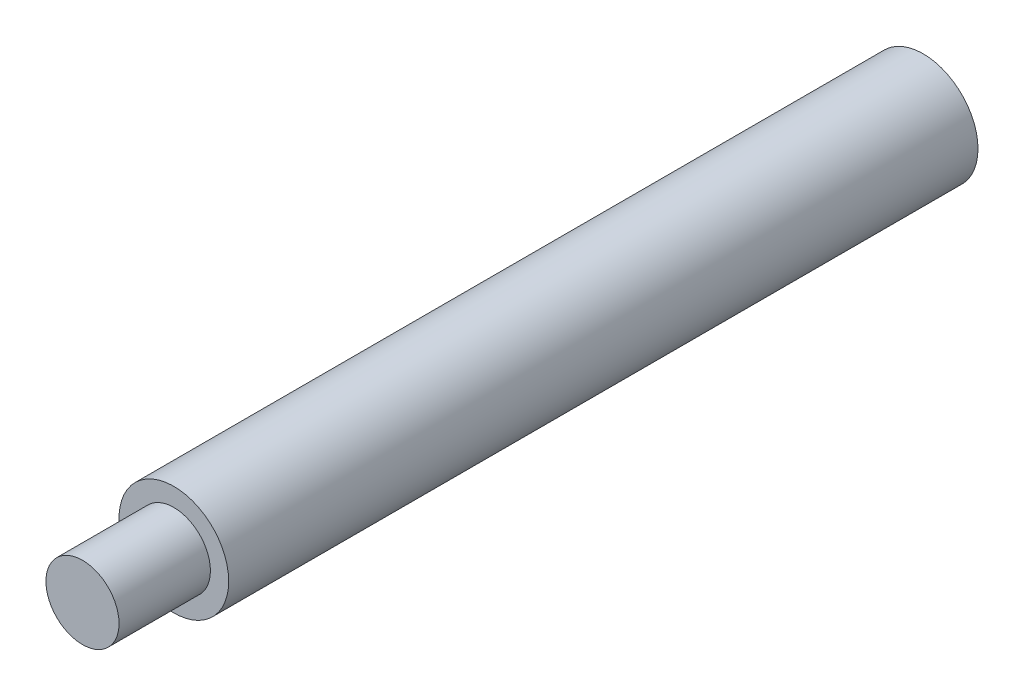
ISO-10303-21;
HEADER;
FILE_DESCRIPTION(('STEP AP214'),'2;1');
FILE_NAME('part.step','',(''),(''),'','','');
FILE_SCHEMA(('AUTOMOTIVE_DESIGN { 1 0 10303 214 1 1 1 1 }'));
ENDSEC;
DATA;
#1=APPLICATION_CONTEXT('core data for automotive mechanical design processes');
#2=APPLICATION_PROTOCOL_DEFINITION('international standard','automotive_design',2000,#1);
#3=PRODUCT_CONTEXT('',#1,'mechanical');
#4=PRODUCT('Part','Part','',(#3));
#5=PRODUCT_RELATED_PRODUCT_CATEGORY('part','',(#4));
#6=PRODUCT_DEFINITION_FORMATION('','',#4);
#7=PRODUCT_DEFINITION_CONTEXT('part definition',#1,'design');
#8=PRODUCT_DEFINITION('design','',#6,#7);
#9=PRODUCT_DEFINITION_SHAPE('','',#8);
#10=(LENGTH_UNIT() NAMED_UNIT(*) SI_UNIT(.MILLI.,.METRE.));
#11=(NAMED_UNIT(*) PLANE_ANGLE_UNIT() SI_UNIT($,.RADIAN.));
#12=(NAMED_UNIT(*) SI_UNIT($,.STERADIAN.) SOLID_ANGLE_UNIT());
#13=UNCERTAINTY_MEASURE_WITH_UNIT(LENGTH_MEASURE(1.E-05),#10,'distance_accuracy_value','');
#14=(GEOMETRIC_REPRESENTATION_CONTEXT(3) GLOBAL_UNCERTAINTY_ASSIGNED_CONTEXT((#13)) GLOBAL_UNIT_ASSIGNED_CONTEXT((#10,
#11,#12)) REPRESENTATION_CONTEXT('',''));
#15=CARTESIAN_POINT('',(0.,0.,0.));
#16=DIRECTION('',(0.,0.,1.));
#17=DIRECTION('',(1.,0.,0.));
#18=AXIS2_PLACEMENT_3D('',#15,#16,#17);
#19=CARTESIAN_POINT('',(0.,0.,2.5));
#20=DIRECTION('',(0.,0.,-1.));
#21=DIRECTION('',(-1.,0.,0.));
#22=AXIS2_PLACEMENT_3D('',#19,#20,#21);
#23=CYLINDRICAL_SURFACE('',#22,1.);
#24=CARTESIAN_POINT('',(0.,0.,2.5));
#25=DIRECTION('',(0.,0.,1.));
#26=DIRECTION('',(1.,0.,0.));
#27=AXIS2_PLACEMENT_3D('',#24,#25,#26);
#28=CIRCLE('',#27,1.);
#29=CARTESIAN_POINT('',(1.,0.,2.5));
#30=VERTEX_POINT('',#29);
#31=EDGE_CURVE('E10',#30,#30,#28,.T.);
#32=ORIENTED_EDGE('',*,*,#31,.F.);
#33=EDGE_LOOP('',(#32));
#34=FACE_BOUND('',#33,.T.);
#35=CARTESIAN_POINT('',(0.,0.,0.));
#36=DIRECTION('',(0.,0.,1.));
#37=DIRECTION('',(1.,0.,0.));
#38=AXIS2_PLACEMENT_3D('',#35,#36,#37);
#39=CIRCLE('',#38,1.);
#40=CARTESIAN_POINT('',(1.,0.,0.));
#41=VERTEX_POINT('',#40);
#42=EDGE_CURVE('E37',#41,#41,#39,.T.);
#43=ORIENTED_EDGE('',*,*,#42,.T.);
#44=EDGE_LOOP('',(#43));
#45=FACE_BOUND('',#44,.T.);
#46=ADVANCED_FACE('F31',(#34,#45),#23,.T.);
#47=CARTESIAN_POINT('',(0.,0.,2.5));
#48=DIRECTION('',(0.,0.,1.));
#49=DIRECTION('',(1.,0.,0.));
#50=AXIS2_PLACEMENT_3D('',#47,#48,#49);
#51=PLANE('',#50);
#52=ORIENTED_EDGE('',*,*,#31,.T.);
#53=EDGE_LOOP('',(#52));
#54=FACE_BOUND('',#53,.T.);
#55=ADVANCED_FACE('F56',(#54),#51,.T.);
#56=CARTESIAN_POINT('',(0.,0.,-20.5));
#57=DIRECTION('',(0.,0.,1.));
#58=DIRECTION('',(1.,0.,0.));
#59=AXIS2_PLACEMENT_3D('',#56,#57,#58);
#60=CYLINDRICAL_SURFACE('',#59,1.5);
#61=CARTESIAN_POINT('',(0.,0.,-20.5));
#62=DIRECTION('',(0.,0.,1.));
#63=DIRECTION('',(1.,0.,0.));
#64=AXIS2_PLACEMENT_3D('',#61,#62,#63);
#65=CIRCLE('',#64,1.5);
#66=CARTESIAN_POINT('',(1.5,0.,-20.5));
#67=VERTEX_POINT('',#66);
#68=EDGE_CURVE('E41',#67,#67,#65,.T.);
#69=ORIENTED_EDGE('',*,*,#68,.T.);
#70=EDGE_LOOP('',(#69));
#71=FACE_BOUND('',#70,.T.);
#72=CARTESIAN_POINT('',(0.,0.,0.));
#73=DIRECTION('',(0.,0.,1.));
#74=DIRECTION('',(1.,0.,0.));
#75=AXIS2_PLACEMENT_3D('',#72,#73,#74);
#76=CIRCLE('',#75,1.5);
#77=CARTESIAN_POINT('',(1.5,0.,0.));
#78=VERTEX_POINT('',#77);
#79=EDGE_CURVE('E45',#78,#78,#76,.T.);
#80=ORIENTED_EDGE('',*,*,#79,.F.);
#81=EDGE_LOOP('',(#80));
#82=FACE_BOUND('',#81,.T.);
#83=ADVANCED_FACE('F53',(#71,#82),#60,.T.);
#84=CARTESIAN_POINT('',(0.,0.,-20.5));
#85=DIRECTION('',(0.,0.,1.));
#86=DIRECTION('',(1.,0.,0.));
#87=AXIS2_PLACEMENT_3D('',#84,#85,#86);
#88=PLANE('',#87);
#89=ORIENTED_EDGE('',*,*,#68,.F.);
#90=EDGE_LOOP('',(#89));
#91=FACE_BOUND('',#90,.T.);
#92=ADVANCED_FACE('F55',(#91),#88,.F.);
#93=CARTESIAN_POINT('',(0.,0.,0.));
#94=DIRECTION('',(0.,0.,1.));
#95=DIRECTION('',(1.,0.,0.));
#96=AXIS2_PLACEMENT_3D('',#93,#94,#95);
#97=PLANE('',#96);
#98=ORIENTED_EDGE('',*,*,#42,.F.);
#99=EDGE_LOOP('',(#98));
#100=FACE_BOUND('',#99,.T.);
#101=ORIENTED_EDGE('',*,*,#79,.T.);
#102=EDGE_LOOP('',(#101));
#103=FACE_BOUND('',#102,.T.);
#104=ADVANCED_FACE('F51',(#100,#103),#97,.T.);
#105=CLOSED_SHELL('',(#46,#55,#83,#92,#104));
#106=MANIFOLD_SOLID_BREP('B2',#105);
#107=ADVANCED_BREP_SHAPE_REPRESENTATION('',(#18,#106),#14);
#108=SHAPE_DEFINITION_REPRESENTATION(#9,#107);
ENDSEC;
END-ISO-10303-21;
